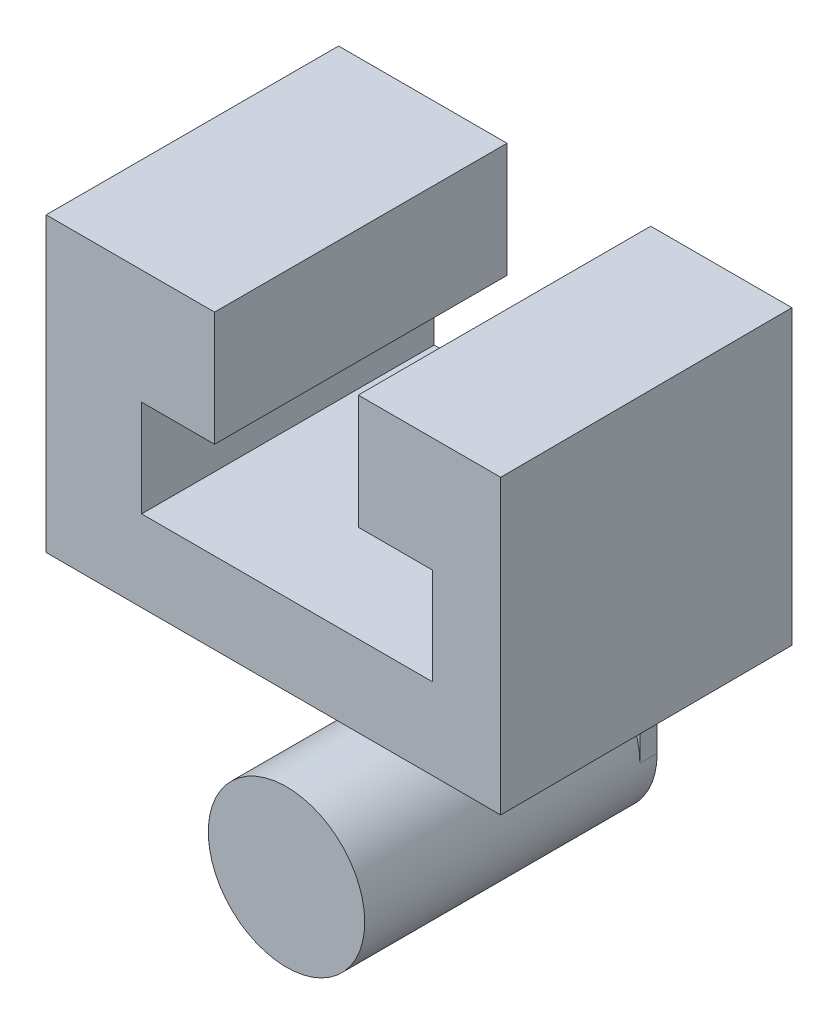
ISO-10303-21;
HEADER;
FILE_DESCRIPTION(('STEP AP214'),'2;1');
FILE_NAME('part.step','',(''),(''),'','','');
FILE_SCHEMA(('AUTOMOTIVE_DESIGN { 1 0 10303 214 1 1 1 1 }'));
ENDSEC;
DATA;
#1=APPLICATION_CONTEXT('core data for automotive mechanical design processes');
#2=APPLICATION_PROTOCOL_DEFINITION('international standard','automotive_design',2000,#1);
#3=PRODUCT_CONTEXT('',#1,'mechanical');
#4=PRODUCT('Part','Part','',(#3));
#5=PRODUCT_RELATED_PRODUCT_CATEGORY('part','',(#4));
#6=PRODUCT_DEFINITION_FORMATION('','',#4);
#7=PRODUCT_DEFINITION_CONTEXT('part definition',#1,'design');
#8=PRODUCT_DEFINITION('design','',#6,#7);
#9=PRODUCT_DEFINITION_SHAPE('','',#8);
#10=(LENGTH_UNIT() NAMED_UNIT(*) SI_UNIT(.MILLI.,.METRE.));
#11=(NAMED_UNIT(*) PLANE_ANGLE_UNIT() SI_UNIT($,.RADIAN.));
#12=(NAMED_UNIT(*) SI_UNIT($,.STERADIAN.) SOLID_ANGLE_UNIT());
#13=UNCERTAINTY_MEASURE_WITH_UNIT(LENGTH_MEASURE(1.E-05),#10,'distance_accuracy_value','');
#14=(GEOMETRIC_REPRESENTATION_CONTEXT(3) GLOBAL_UNCERTAINTY_ASSIGNED_CONTEXT((#13)) GLOBAL_UNIT_ASSIGNED_CONTEXT((#10,
#11,#12)) REPRESENTATION_CONTEXT('',''));
#15=CARTESIAN_POINT('',(0.,0.,0.));
#16=DIRECTION('',(0.,0.,1.));
#17=DIRECTION('',(1.,0.,0.));
#18=AXIS2_PLACEMENT_3D('',#15,#16,#17);
#19=CARTESIAN_POINT('',(0.,39.37,0.));
#20=DIRECTION('',(0.,1.,0.));
#21=DIRECTION('',(0.,0.,1.));
#22=AXIS2_PLACEMENT_3D('',#19,#20,#21);
#23=PLANE('',#22);
#24=DIRECTION('',(-1.,0.,1.06356052291846E-08));
#25=VECTOR('',#24,1.);
#26=CARTESIAN_POINT('',(-20.8762299865692,39.37,-25.3999998514206));
#27=LINE('',#26,#25);
#28=CARTESIAN_POINT('',(18.4937700134308,39.37,-25.4000002701444));
#29=VERTEX_POINT('',#28);
#30=CARTESIAN_POINT('',(6.23366288880171,39.37,-25.4));
#31=VERTEX_POINT('',#30);
#32=EDGE_CURVE('E223',#29,#31,#27,.T.);
#33=ORIENTED_EDGE('',*,*,#32,.T.);
#34=DIRECTION('',(0.,0.,1.));
#35=VECTOR('',#34,1.);
#36=CARTESIAN_POINT('',(6.23366288880171,39.37,-27.94));
#37=LINE('',#36,#35);
#38=CARTESIAN_POINT('',(6.23366288880171,39.37,0.));
#39=VERTEX_POINT('',#38);
#40=EDGE_CURVE('E197',#31,#39,#37,.T.);
#41=ORIENTED_EDGE('',*,*,#40,.T.);
#42=DIRECTION('',(1.,0.,0.));
#43=VECTOR('',#42,1.);
#44=CARTESIAN_POINT('',(-20.8762299865692,39.37,0.));
#45=LINE('',#44,#43);
#46=CARTESIAN_POINT('',(18.6055,39.37,0.));
#47=VERTEX_POINT('',#46);
#48=EDGE_CURVE('E220',#39,#47,#45,.T.);
#49=ORIENTED_EDGE('',*,*,#48,.T.);
#50=DIRECTION('',(-0.00439877576500632,0.,-0.999990325339085));
#51=VECTOR('',#50,1.);
#52=CARTESIAN_POINT('',(18.4937700134308,39.37,-25.4000002701444));
#53=LINE('',#52,#51);
#54=EDGE_CURVE('E225',#47,#29,#53,.T.);
#55=ORIENTED_EDGE('',*,*,#54,.T.);
#56=EDGE_LOOP('',(#33,#41,#49,#55));
#57=FACE_BOUND('',#56,.T.);
#58=ADVANCED_FACE('F39',(#57),#23,.T.);
#59=CARTESIAN_POINT('',(-20.8762299865692,39.37,0.));
#60=DIRECTION('',(0.,0.,-1.));
#61=DIRECTION('',(-1.,0.,0.));
#62=AXIS2_PLACEMENT_3D('',#59,#60,#61);
#63=PLANE('',#62);
#64=DIRECTION('',(0.,1.,0.));
#65=VECTOR('',#64,1.);
#66=CARTESIAN_POINT('',(6.23366288880171,39.37,0.));
#67=LINE('',#66,#65);
#68=CARTESIAN_POINT('',(6.23366288880171,29.4265699259327,0.));
#69=VERTEX_POINT('',#68);
#70=EDGE_CURVE('E173',#69,#39,#67,.T.);
#71=ORIENTED_EDGE('',*,*,#70,.F.);
#72=DIRECTION('',(-1.,0.,0.));
#73=VECTOR('',#72,1.);
#74=CARTESIAN_POINT('',(6.23366288880171,29.4265699259327,0.));
#75=LINE('',#74,#73);
#76=CARTESIAN_POINT('',(12.6933213726731,29.4265699259327,0.));
#77=VERTEX_POINT('',#76);
#78=EDGE_CURVE('E158',#77,#69,#75,.T.);
#79=ORIENTED_EDGE('',*,*,#78,.F.);
#80=DIRECTION('',(0.,1.,0.));
#81=VECTOR('',#80,1.);
#82=CARTESIAN_POINT('',(12.6933213726731,29.4265699259327,0.));
#83=LINE('',#82,#81);
#84=CARTESIAN_POINT('',(12.6933213726731,21.0227423838088,0.));
#85=VERTEX_POINT('',#84);
#86=EDGE_CURVE('E169',#85,#77,#83,.T.);
#87=ORIENTED_EDGE('',*,*,#86,.F.);
#88=DIRECTION('',(1.,0.,0.));
#89=VECTOR('',#88,1.);
#90=CARTESIAN_POINT('',(0.,21.0227423838088,0.));
#91=LINE('',#90,#89);
#92=CARTESIAN_POINT('',(-12.5808763846101,21.0227423838088,0.));
#93=VERTEX_POINT('',#92);
#94=EDGE_CURVE('E53',#93,#85,#91,.T.);
#95=ORIENTED_EDGE('',*,*,#94,.F.);
#96=DIRECTION('',(0.,-1.,0.));
#97=VECTOR('',#96,1.);
#98=CARTESIAN_POINT('',(-12.5808763846101,21.0227423838088,0.));
#99=LINE('',#98,#97);
#100=CARTESIAN_POINT('',(-12.5808763846101,29.4265699259327,0.));
#101=VERTEX_POINT('',#100);
#102=EDGE_CURVE('E184',#101,#93,#99,.T.);
#103=ORIENTED_EDGE('',*,*,#102,.F.);
#104=DIRECTION('',(-1.,0.,0.));
#105=VECTOR('',#104,1.);
#106=CARTESIAN_POINT('',(-12.5808763846101,29.4265699259327,0.));
#107=LINE('',#106,#105);
#108=CARTESIAN_POINT('',(-6.24664816256149,29.4265699259327,0.));
#109=VERTEX_POINT('',#108);
#110=EDGE_CURVE('E182',#109,#101,#107,.T.);
#111=ORIENTED_EDGE('',*,*,#110,.F.);
#112=DIRECTION('',(0.,-1.,0.));
#113=VECTOR('',#112,1.);
#114=CARTESIAN_POINT('',(-6.24664816256149,29.4265699259327,0.));
#115=LINE('',#114,#113);
#116=CARTESIAN_POINT('',(-6.24664816256149,39.37,0.));
#117=VERTEX_POINT('',#116);
#118=EDGE_CURVE('E179',#117,#109,#115,.T.);
#119=ORIENTED_EDGE('',*,*,#118,.F.);
#120=CARTESIAN_POINT('',(-20.8762299865692,39.37,0.));
#121=VERTEX_POINT('',#120);
#122=EDGE_CURVE('E218',#121,#117,#45,.T.);
#123=ORIENTED_EDGE('',*,*,#122,.F.);
#124=DIRECTION('',(0.,-1.,0.));
#125=VECTOR('',#124,1.);
#126=CARTESIAN_POINT('',(-20.8762299865692,39.37,0.));
#127=LINE('',#126,#125);
#128=CARTESIAN_POINT('',(-20.8762299865692,13.97,0.));
#129=VERTEX_POINT('',#128);
#130=EDGE_CURVE('E249',#121,#129,#127,.T.);
#131=ORIENTED_EDGE('',*,*,#130,.T.);
#132=DIRECTION('',(1.,0.,0.));
#133=VECTOR('',#132,1.);
#134=CARTESIAN_POINT('',(-20.8762299865692,13.97,0.));
#135=LINE('',#134,#133);
#136=CARTESIAN_POINT('',(18.6055,13.97,0.));
#137=VERTEX_POINT('',#136);
#138=EDGE_CURVE('E234',#129,#137,#135,.T.);
#139=ORIENTED_EDGE('',*,*,#138,.T.);
#140=DIRECTION('',(0.,-1.,0.));
#141=VECTOR('',#140,1.);
#142=CARTESIAN_POINT('',(18.6055,39.37,0.));
#143=LINE('',#142,#141);
#144=EDGE_CURVE('E242',#47,#137,#143,.T.);
#145=ORIENTED_EDGE('',*,*,#144,.F.);
#146=ORIENTED_EDGE('',*,*,#48,.F.);
#147=EDGE_LOOP('',(#71,#79,#87,#95,#103,#111,#119,#123,#131,#139,#145,#146));
#148=FACE_BOUND('',#147,.T.);
#149=ADVANCED_FACE('F175',(#148),#63,.F.);
#150=CARTESIAN_POINT('',(0.,0.,-25.4));
#151=DIRECTION('',(0.,0.,1.));
#152=DIRECTION('',(1.,0.,0.));
#153=AXIS2_PLACEMENT_3D('',#150,#151,#152);
#154=CYLINDRICAL_SURFACE('',#153,6.7945);
#155=CARTESIAN_POINT('',(0.,0.,0.));
#156=DIRECTION('',(0.,0.,1.));
#157=DIRECTION('',(1.,0.,0.));
#158=AXIS2_PLACEMENT_3D('',#155,#156,#157);
#159=CIRCLE('',#158,6.7945);
#160=CARTESIAN_POINT('',(6.7945,0.,0.));
#161=VERTEX_POINT('',#160);
#162=EDGE_CURVE('E271',#161,#161,#159,.T.);
#163=ORIENTED_EDGE('',*,*,#162,.F.);
#164=EDGE_LOOP('',(#163));
#165=FACE_BOUND('',#164,.T.);
#166=CARTESIAN_POINT('',(0.,0.,-23.8994618685465));
#167=DIRECTION('',(0.,0.,-1.));
#168=DIRECTION('',(-1.,0.,0.));
#169=AXIS2_PLACEMENT_3D('',#166,#167,#168);
#170=CIRCLE('',#169,6.7945);
#171=CARTESIAN_POINT('',(6.7945,0.,-23.8994618685465));
#172=VERTEX_POINT('',#171);
#173=CARTESIAN_POINT('',(-6.7945,0.,-23.8994618685465));
#174=VERTEX_POINT('',#173);
#175=EDGE_CURVE('E274',#172,#174,#170,.F.);
#176=ORIENTED_EDGE('',*,*,#175,.T.);
#177=DIRECTION('',(0.,0.,1.));
#178=VECTOR('',#177,1.);
#179=CARTESIAN_POINT('',(-6.7945,0.,-25.4));
#180=LINE('',#179,#178);
#181=CARTESIAN_POINT('',(-6.7945,0.,-25.4));
#182=VERTEX_POINT('',#181);
#183=EDGE_CURVE('E248',#182,#174,#180,.T.);
#184=ORIENTED_EDGE('',*,*,#183,.F.);
#185=CARTESIAN_POINT('',(0.,0.,-25.4));
#186=DIRECTION('',(0.,0.,1.));
#187=DIRECTION('',(1.,0.,0.));
#188=AXIS2_PLACEMENT_3D('',#185,#186,#187);
#189=CIRCLE('',#188,6.7945);
#190=CARTESIAN_POINT('',(6.7945,0.,-25.4));
#191=VERTEX_POINT('',#190);
#192=EDGE_CURVE('E275',#182,#191,#189,.T.);
#193=ORIENTED_EDGE('',*,*,#192,.T.);
#194=DIRECTION('',(0.,0.,-1.));
#195=VECTOR('',#194,1.);
#196=CARTESIAN_POINT('',(6.7945,0.,-25.4));
#197=LINE('',#196,#195);
#198=EDGE_CURVE('E255',#172,#191,#197,.T.);
#199=ORIENTED_EDGE('',*,*,#198,.F.);
#200=EDGE_LOOP('',(#176,#184,#193,#199));
#201=FACE_BOUND('',#200,.T.);
#202=ADVANCED_FACE('F41',(#165,#201),#154,.T.);
#203=CARTESIAN_POINT('',(0.,0.,-25.4));
#204=DIRECTION('',(0.,0.,1.));
#205=DIRECTION('',(1.,0.,0.));
#206=AXIS2_PLACEMENT_3D('',#203,#204,#205);
#207=PLANE('',#206);
#208=CARTESIAN_POINT('',(-6.24664816256149,39.37,-25.4));
#209=VERTEX_POINT('',#208);
#210=CARTESIAN_POINT('',(-20.8762299865692,39.37,-25.3999998514206));
#211=VERTEX_POINT('',#210);
#212=EDGE_CURVE('E221',#209,#211,#27,.T.);
#213=ORIENTED_EDGE('',*,*,#212,.F.);
#214=DIRECTION('',(0.,-1.,0.));
#215=VECTOR('',#214,1.);
#216=CARTESIAN_POINT('',(-6.24664816256149,0.,-25.4));
#217=LINE('',#216,#215);
#218=CARTESIAN_POINT('',(-6.24664816256149,29.4265699259327,-25.4));
#219=VERTEX_POINT('',#218);
#220=EDGE_CURVE('E11',#209,#219,#217,.T.);
#221=ORIENTED_EDGE('',*,*,#220,.T.);
#222=DIRECTION('',(-1.,0.,0.));
#223=VECTOR('',#222,1.);
#224=CARTESIAN_POINT('',(0.,29.4265699259327,-25.4));
#225=LINE('',#224,#223);
#226=CARTESIAN_POINT('',(-12.5808763846101,29.4265699259327,-25.4));
#227=VERTEX_POINT('',#226);
#228=EDGE_CURVE('E204',#219,#227,#225,.T.);
#229=ORIENTED_EDGE('',*,*,#228,.T.);
#230=DIRECTION('',(0.,-1.,0.));
#231=VECTOR('',#230,1.);
#232=CARTESIAN_POINT('',(-12.5808763846101,0.,-25.4));
#233=LINE('',#232,#231);
#234=CARTESIAN_POINT('',(-12.5808763846101,21.0227423838088,-25.4));
#235=VERTEX_POINT('',#234);
#236=EDGE_CURVE('E210',#227,#235,#233,.T.);
#237=ORIENTED_EDGE('',*,*,#236,.T.);
#238=DIRECTION('',(1.,0.,0.));
#239=VECTOR('',#238,1.);
#240=CARTESIAN_POINT('',(0.,21.0227423838088,-25.4));
#241=LINE('',#240,#239);
#242=CARTESIAN_POINT('',(12.6933213726731,21.0227423838088,-25.4));
#243=VERTEX_POINT('',#242);
#244=EDGE_CURVE('E209',#235,#243,#241,.T.);
#245=ORIENTED_EDGE('',*,*,#244,.T.);
#246=DIRECTION('',(0.,1.,0.));
#247=VECTOR('',#246,1.);
#248=CARTESIAN_POINT('',(12.6933213726731,0.,-25.4));
#249=LINE('',#248,#247);
#250=CARTESIAN_POINT('',(12.6933213726731,29.4265699259327,-25.4));
#251=VERTEX_POINT('',#250);
#252=EDGE_CURVE('E189',#243,#251,#249,.T.);
#253=ORIENTED_EDGE('',*,*,#252,.T.);
#254=DIRECTION('',(-1.,0.,0.));
#255=VECTOR('',#254,1.);
#256=CARTESIAN_POINT('',(0.,29.4265699259327,-25.4));
#257=LINE('',#256,#255);
#258=CARTESIAN_POINT('',(6.23366288880171,29.4265699259327,-25.4));
#259=VERTEX_POINT('',#258);
#260=EDGE_CURVE('E161',#251,#259,#257,.T.);
#261=ORIENTED_EDGE('',*,*,#260,.T.);
#262=DIRECTION('',(0.,1.,0.));
#263=VECTOR('',#262,1.);
#264=CARTESIAN_POINT('',(6.23366288880171,0.,-25.4));
#265=LINE('',#264,#263);
#266=EDGE_CURVE('E50',#259,#31,#265,.T.);
#267=ORIENTED_EDGE('',*,*,#266,.T.);
#268=ORIENTED_EDGE('',*,*,#32,.F.);
#269=DIRECTION('',(0.,-1.,0.));
#270=VECTOR('',#269,1.);
#271=CARTESIAN_POINT('',(18.4937700134308,39.37,-25.4000002701444));
#272=LINE('',#271,#270);
#273=CARTESIAN_POINT('',(18.4937700134308,13.97,-25.4000002701444));
#274=VERTEX_POINT('',#273);
#275=EDGE_CURVE('E238',#29,#274,#272,.T.);
#276=ORIENTED_EDGE('',*,*,#275,.T.);
#277=DIRECTION('',(-1.,0.,1.06356052291846E-08));
#278=VECTOR('',#277,1.);
#279=CARTESIAN_POINT('',(-20.8762299865692,13.97,-25.3999998514206));
#280=LINE('',#279,#278);
#281=CARTESIAN_POINT('',(6.7945,13.97,-25.4000001457156));
#282=VERTEX_POINT('',#281);
#283=EDGE_CURVE('E217',#274,#282,#280,.T.);
#284=ORIENTED_EDGE('',*,*,#283,.T.);
#285=DIRECTION('',(0.,-1.,0.));
#286=VECTOR('',#285,1.);
#287=CARTESIAN_POINT('',(6.7945,13.97,-25.4));
#288=LINE('',#287,#286);
#289=EDGE_CURVE('E264',#282,#191,#288,.T.);
#290=ORIENTED_EDGE('',*,*,#289,.T.);
#291=ORIENTED_EDGE('',*,*,#192,.F.);
#292=DIRECTION('',(0.,-1.,0.));
#293=VECTOR('',#292,1.);
#294=CARTESIAN_POINT('',(-6.7945,13.97,-25.4));
#295=LINE('',#294,#293);
#296=CARTESIAN_POINT('',(-6.7945,13.97,-25.4));
#297=VERTEX_POINT('',#296);
#298=EDGE_CURVE('E257',#297,#182,#295,.T.);
#299=ORIENTED_EDGE('',*,*,#298,.F.);
#300=CARTESIAN_POINT('',(-20.8762299865692,13.97,-25.3999998514206));
#301=VERTEX_POINT('',#300);
#302=EDGE_CURVE('E232',#297,#301,#280,.T.);
#303=ORIENTED_EDGE('',*,*,#302,.T.);
#304=DIRECTION('',(0.,-1.,0.));
#305=VECTOR('',#304,1.);
#306=CARTESIAN_POINT('',(-20.8762299865692,39.37,-25.3999998514206));
#307=LINE('',#306,#305);
#308=EDGE_CURVE('E227',#211,#301,#307,.T.);
#309=ORIENTED_EDGE('',*,*,#308,.F.);
#310=EDGE_LOOP('',(#213,#221,#229,#237,#245,#253,#261,#267,#268,#276,#284,#290,#291,#299,#303,#309));
#311=FACE_BOUND('',#310,.T.);
#312=ADVANCED_FACE('F282',(#311),#207,.F.);
#313=CARTESIAN_POINT('',(0.,0.,0.));
#314=DIRECTION('',(0.,0.,1.));
#315=DIRECTION('',(1.,0.,0.));
#316=AXIS2_PLACEMENT_3D('',#313,#314,#315);
#317=PLANE('',#316);
#318=ORIENTED_EDGE('',*,*,#162,.T.);
#319=EDGE_LOOP('',(#318));
#320=FACE_BOUND('',#319,.T.);
#321=ADVANCED_FACE('F364',(#320),#317,.T.);
#322=CARTESIAN_POINT('',(-6.7945,13.97,-25.4));
#323=DIRECTION('',(1.,0.,0.));
#324=DIRECTION('',(0.,0.,-1.));
#325=AXIS2_PLACEMENT_3D('',#322,#323,#324);
#326=PLANE('',#325);
#327=ORIENTED_EDGE('',*,*,#183,.T.);
#328=DIRECTION('',(0.,-1.,0.));
#329=VECTOR('',#328,1.);
#330=CARTESIAN_POINT('',(-6.7945,13.97,-23.8994618685465));
#331=LINE('',#330,#329);
#332=CARTESIAN_POINT('',(-6.7945,13.97,-23.8994618685465));
#333=VERTEX_POINT('',#332);
#334=EDGE_CURVE('E267',#333,#174,#331,.T.);
#335=ORIENTED_EDGE('',*,*,#334,.F.);
#336=DIRECTION('',(0.,0.,1.));
#337=VECTOR('',#336,1.);
#338=CARTESIAN_POINT('',(-6.7945,13.97,-25.4));
#339=LINE('',#338,#337);
#340=EDGE_CURVE('E247',#297,#333,#339,.T.);
#341=ORIENTED_EDGE('',*,*,#340,.F.);
#342=ORIENTED_EDGE('',*,*,#298,.T.);
#343=EDGE_LOOP('',(#327,#335,#341,#342));
#344=FACE_BOUND('',#343,.T.);
#345=ADVANCED_FACE('F305',(#344),#326,.F.);
#346=CARTESIAN_POINT('',(-6.7945,13.97,-23.8994618685465));
#347=DIRECTION('',(0.,0.,-1.));
#348=DIRECTION('',(-1.,0.,0.));
#349=AXIS2_PLACEMENT_3D('',#346,#347,#348);
#350=PLANE('',#349);
#351=ORIENTED_EDGE('',*,*,#175,.F.);
#352=DIRECTION('',(0.,-1.,0.));
#353=VECTOR('',#352,1.);
#354=CARTESIAN_POINT('',(6.7945,13.97,-23.8994618685465));
#355=LINE('',#354,#353);
#356=CARTESIAN_POINT('',(6.7945,13.97,-23.8994618685465));
#357=VERTEX_POINT('',#356);
#358=EDGE_CURVE('E65',#357,#172,#355,.T.);
#359=ORIENTED_EDGE('',*,*,#358,.F.);
#360=DIRECTION('',(1.,0.,0.));
#361=VECTOR('',#360,1.);
#362=CARTESIAN_POINT('',(-6.7945,13.97,-23.8994618685465));
#363=LINE('',#362,#361);
#364=EDGE_CURVE('E251',#333,#357,#363,.T.);
#365=ORIENTED_EDGE('',*,*,#364,.F.);
#366=ORIENTED_EDGE('',*,*,#334,.T.);
#367=EDGE_LOOP('',(#351,#359,#365,#366));
#368=FACE_BOUND('',#367,.T.);
#369=ADVANCED_FACE('F358',(#368),#350,.F.);
#370=CARTESIAN_POINT('',(6.7945,13.97,-25.4));
#371=DIRECTION('',(-1.,0.,0.));
#372=DIRECTION('',(0.,0.,1.));
#373=AXIS2_PLACEMENT_3D('',#370,#371,#372);
#374=PLANE('',#373);
#375=ORIENTED_EDGE('',*,*,#198,.T.);
#376=ORIENTED_EDGE('',*,*,#289,.F.);
#377=DIRECTION('',(0.,0.,-1.));
#378=VECTOR('',#377,1.);
#379=CARTESIAN_POINT('',(6.7945,13.97,-25.4));
#380=LINE('',#379,#378);
#381=EDGE_CURVE('E260',#357,#282,#380,.T.);
#382=ORIENTED_EDGE('',*,*,#381,.F.);
#383=ORIENTED_EDGE('',*,*,#358,.T.);
#384=EDGE_LOOP('',(#375,#376,#382,#383));
#385=FACE_BOUND('',#384,.T.);
#386=ADVANCED_FACE('F296',(#385),#374,.F.);
#387=CARTESIAN_POINT('',(0.,13.97,0.));
#388=DIRECTION('',(0.,1.,0.));
#389=DIRECTION('',(0.,0.,1.));
#390=AXIS2_PLACEMENT_3D('',#387,#388,#389);
#391=PLANE('',#390);
#392=ORIENTED_EDGE('',*,*,#302,.F.);
#393=ORIENTED_EDGE('',*,*,#340,.T.);
#394=ORIENTED_EDGE('',*,*,#364,.T.);
#395=ORIENTED_EDGE('',*,*,#381,.T.);
#396=ORIENTED_EDGE('',*,*,#283,.F.);
#397=DIRECTION('',(-0.00439877576500632,0.,-0.999990325339085));
#398=VECTOR('',#397,1.);
#399=CARTESIAN_POINT('',(18.4937700134308,13.97,-25.4000002701444));
#400=LINE('',#399,#398);
#401=EDGE_CURVE('E235',#137,#274,#400,.T.);
#402=ORIENTED_EDGE('',*,*,#401,.F.);
#403=ORIENTED_EDGE('',*,*,#138,.F.);
#404=DIRECTION('',(0.,0.,1.));
#405=VECTOR('',#404,1.);
#406=CARTESIAN_POINT('',(-20.8762299865692,13.97,-25.3999998514206));
#407=LINE('',#406,#405);
#408=EDGE_CURVE('E213',#301,#129,#407,.T.);
#409=ORIENTED_EDGE('',*,*,#408,.F.);
#410=EDGE_LOOP('',(#392,#393,#394,#395,#396,#402,#403,#409));
#411=FACE_BOUND('',#410,.T.);
#412=ADVANCED_FACE('F293',(#411),#391,.F.);
#413=CARTESIAN_POINT('',(-20.8762299865692,39.37,-25.3999998514206));
#414=DIRECTION('',(1.,0.,0.));
#415=DIRECTION('',(0.,0.,-1.));
#416=AXIS2_PLACEMENT_3D('',#413,#414,#415);
#417=PLANE('',#416);
#418=ORIENTED_EDGE('',*,*,#408,.T.);
#419=ORIENTED_EDGE('',*,*,#130,.F.);
#420=DIRECTION('',(0.,0.,1.));
#421=VECTOR('',#420,1.);
#422=CARTESIAN_POINT('',(-20.8762299865692,39.37,-25.3999998514206));
#423=LINE('',#422,#421);
#424=EDGE_CURVE('E212',#211,#121,#423,.T.);
#425=ORIENTED_EDGE('',*,*,#424,.F.);
#426=ORIENTED_EDGE('',*,*,#308,.T.);
#427=EDGE_LOOP('',(#418,#419,#425,#426));
#428=FACE_BOUND('',#427,.T.);
#429=ADVANCED_FACE('F310',(#428),#417,.F.);
#430=CARTESIAN_POINT('',(18.4937700134308,39.37,-25.4000002701444));
#431=DIRECTION('',(-0.999990325339085,0.,0.00439877576500632));
#432=DIRECTION('',(0.00439877576500632,0.,0.999990325339085));
#433=AXIS2_PLACEMENT_3D('',#430,#431,#432);
#434=PLANE('',#433);
#435=ORIENTED_EDGE('',*,*,#401,.T.);
#436=ORIENTED_EDGE('',*,*,#275,.F.);
#437=ORIENTED_EDGE('',*,*,#54,.F.);
#438=ORIENTED_EDGE('',*,*,#144,.T.);
#439=EDGE_LOOP('',(#435,#436,#437,#438));
#440=FACE_BOUND('',#439,.T.);
#441=ADVANCED_FACE('F287',(#440),#434,.F.);
#442=DIRECTION('',(0.,0.,1.));
#443=VECTOR('',#442,1.);
#444=CARTESIAN_POINT('',(-6.24664816256149,39.37,-27.94));
#445=LINE('',#444,#443);
#446=EDGE_CURVE('E192',#209,#117,#445,.T.);
#447=ORIENTED_EDGE('',*,*,#446,.F.);
#448=ORIENTED_EDGE('',*,*,#212,.T.);
#449=ORIENTED_EDGE('',*,*,#424,.T.);
#450=ORIENTED_EDGE('',*,*,#122,.T.);
#451=EDGE_LOOP('',(#447,#448,#449,#450));
#452=FACE_BOUND('',#451,.T.);
#453=ADVANCED_FACE('F312',(#452),#23,.T.);
#454=CARTESIAN_POINT('',(-6.24664816256149,29.4265699259327,-27.94));
#455=DIRECTION('',(-1.,0.,0.));
#456=DIRECTION('',(0.,0.,1.));
#457=AXIS2_PLACEMENT_3D('',#454,#455,#456);
#458=PLANE('',#457);
#459=ORIENTED_EDGE('',*,*,#446,.T.);
#460=ORIENTED_EDGE('',*,*,#118,.T.);
#461=DIRECTION('',(0.,0.,1.));
#462=VECTOR('',#461,1.);
#463=CARTESIAN_POINT('',(-6.24664816256149,29.4265699259327,-27.94));
#464=LINE('',#463,#462);
#465=EDGE_CURVE('E195',#219,#109,#464,.T.);
#466=ORIENTED_EDGE('',*,*,#465,.F.);
#467=ORIENTED_EDGE('',*,*,#220,.F.);
#468=EDGE_LOOP('',(#459,#460,#466,#467));
#469=FACE_BOUND('',#468,.T.);
#470=ADVANCED_FACE('F318',(#469),#458,.F.);
#471=CARTESIAN_POINT('',(6.23366288880171,39.37,-27.94));
#472=DIRECTION('',(1.,0.,0.));
#473=DIRECTION('',(0.,0.,-1.));
#474=AXIS2_PLACEMENT_3D('',#471,#472,#473);
#475=PLANE('',#474);
#476=DIRECTION('',(0.,0.,1.));
#477=VECTOR('',#476,1.);
#478=CARTESIAN_POINT('',(6.23366288880171,29.4265699259327,-27.94));
#479=LINE('',#478,#477);
#480=EDGE_CURVE('E163',#259,#69,#479,.T.);
#481=ORIENTED_EDGE('',*,*,#480,.T.);
#482=ORIENTED_EDGE('',*,*,#70,.T.);
#483=ORIENTED_EDGE('',*,*,#40,.F.);
#484=ORIENTED_EDGE('',*,*,#266,.F.);
#485=EDGE_LOOP('',(#481,#482,#483,#484));
#486=FACE_BOUND('',#485,.T.);
#487=ADVANCED_FACE('F327',(#486),#475,.F.);
#488=CARTESIAN_POINT('',(0.,21.0227423838088,-27.94));
#489=DIRECTION('',(0.,-1.,0.));
#490=DIRECTION('',(0.,0.,-1.));
#491=AXIS2_PLACEMENT_3D('',#488,#489,#490);
#492=PLANE('',#491);
#493=DIRECTION('',(0.,0.,1.));
#494=VECTOR('',#493,1.);
#495=CARTESIAN_POINT('',(-12.5808763846101,21.0227423838088,-27.94));
#496=LINE('',#495,#494);
#497=EDGE_CURVE('E187',#235,#93,#496,.T.);
#498=ORIENTED_EDGE('',*,*,#497,.T.);
#499=ORIENTED_EDGE('',*,*,#94,.T.);
#500=DIRECTION('',(0.,0.,1.));
#501=VECTOR('',#500,1.);
#502=CARTESIAN_POINT('',(12.6933213726731,21.0227423838088,-27.94));
#503=LINE('',#502,#501);
#504=EDGE_CURVE('E164',#243,#85,#503,.T.);
#505=ORIENTED_EDGE('',*,*,#504,.F.);
#506=ORIENTED_EDGE('',*,*,#244,.F.);
#507=EDGE_LOOP('',(#498,#499,#505,#506));
#508=FACE_BOUND('',#507,.T.);
#509=ADVANCED_FACE('F326',(#508),#492,.F.);
#510=CARTESIAN_POINT('',(-12.5808763846101,21.0227423838088,-27.94));
#511=DIRECTION('',(-1.,0.,0.));
#512=DIRECTION('',(0.,0.,1.));
#513=AXIS2_PLACEMENT_3D('',#510,#511,#512);
#514=PLANE('',#513);
#515=DIRECTION('',(0.,0.,1.));
#516=VECTOR('',#515,1.);
#517=CARTESIAN_POINT('',(-12.5808763846101,29.4265699259327,-27.94));
#518=LINE('',#517,#516);
#519=EDGE_CURVE('E194',#227,#101,#518,.T.);
#520=ORIENTED_EDGE('',*,*,#519,.T.);
#521=ORIENTED_EDGE('',*,*,#102,.T.);
#522=ORIENTED_EDGE('',*,*,#497,.F.);
#523=ORIENTED_EDGE('',*,*,#236,.F.);
#524=EDGE_LOOP('',(#520,#521,#522,#523));
#525=FACE_BOUND('',#524,.T.);
#526=ADVANCED_FACE('F322',(#525),#514,.F.);
#527=CARTESIAN_POINT('',(-12.5808763846101,29.4265699259327,-27.94));
#528=DIRECTION('',(0.,1.,0.));
#529=DIRECTION('',(0.,0.,1.));
#530=AXIS2_PLACEMENT_3D('',#527,#528,#529);
#531=PLANE('',#530);
#532=ORIENTED_EDGE('',*,*,#465,.T.);
#533=ORIENTED_EDGE('',*,*,#110,.T.);
#534=ORIENTED_EDGE('',*,*,#519,.F.);
#535=ORIENTED_EDGE('',*,*,#228,.F.);
#536=EDGE_LOOP('',(#532,#533,#534,#535));
#537=FACE_BOUND('',#536,.T.);
#538=ADVANCED_FACE('F319',(#537),#531,.F.);
#539=CARTESIAN_POINT('',(6.23366288880171,29.4265699259327,-27.94));
#540=DIRECTION('',(0.,1.,0.));
#541=DIRECTION('',(0.,0.,1.));
#542=AXIS2_PLACEMENT_3D('',#539,#540,#541);
#543=PLANE('',#542);
#544=DIRECTION('',(0.,0.,1.));
#545=VECTOR('',#544,1.);
#546=CARTESIAN_POINT('',(12.6933213726731,29.4265699259327,-27.94));
#547=LINE('',#546,#545);
#548=EDGE_CURVE('E153',#251,#77,#547,.T.);
#549=ORIENTED_EDGE('',*,*,#548,.T.);
#550=ORIENTED_EDGE('',*,*,#78,.T.);
#551=ORIENTED_EDGE('',*,*,#480,.F.);
#552=ORIENTED_EDGE('',*,*,#260,.F.);
#553=EDGE_LOOP('',(#549,#550,#551,#552));
#554=FACE_BOUND('',#553,.T.);
#555=ADVANCED_FACE('F154',(#554),#543,.F.);
#556=CARTESIAN_POINT('',(12.6933213726731,29.4265699259327,-27.94));
#557=DIRECTION('',(1.,0.,0.));
#558=DIRECTION('',(0.,0.,-1.));
#559=AXIS2_PLACEMENT_3D('',#556,#557,#558);
#560=PLANE('',#559);
#561=ORIENTED_EDGE('',*,*,#504,.T.);
#562=ORIENTED_EDGE('',*,*,#86,.T.);
#563=ORIENTED_EDGE('',*,*,#548,.F.);
#564=ORIENTED_EDGE('',*,*,#252,.F.);
#565=EDGE_LOOP('',(#561,#562,#563,#564));
#566=FACE_BOUND('',#565,.T.);
#567=ADVANCED_FACE('F166',(#566),#560,.F.);
#568=CLOSED_SHELL('',(#58,#149,#202,#312,#321,#345,#369,#386,#412,#429,#441,#453,#470,#487,#509,
#526,#538,#555,#567));
#569=MANIFOLD_SOLID_BREP('B2',#568);
#570=ADVANCED_BREP_SHAPE_REPRESENTATION('',(#18,#569),#14);
#571=SHAPE_DEFINITION_REPRESENTATION(#9,#570);
ENDSEC;
END-ISO-10303-21;
